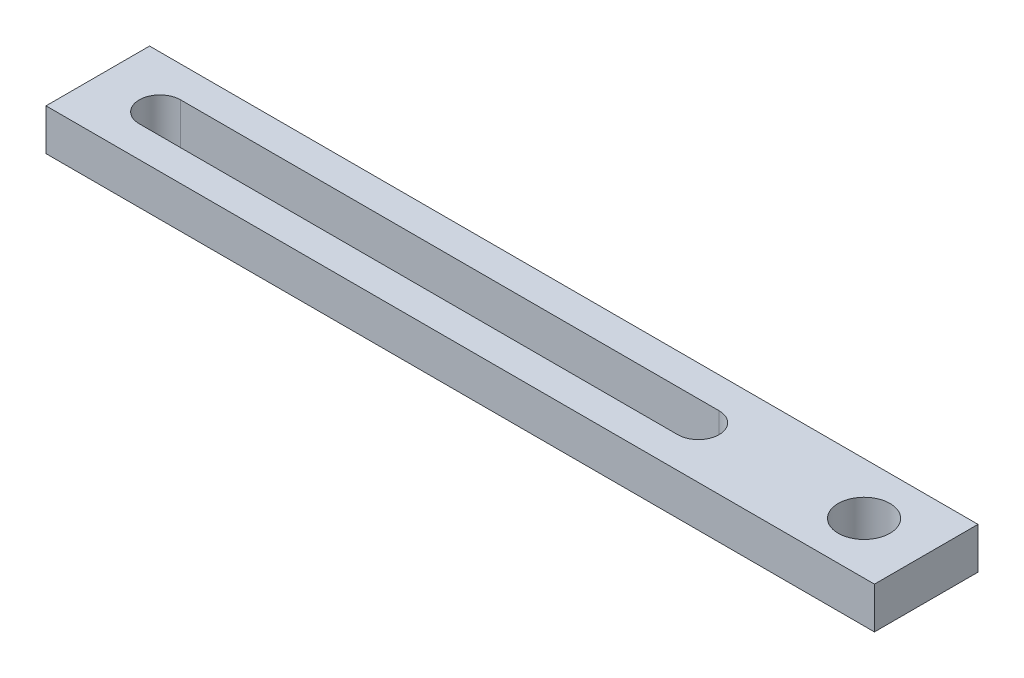
ISO-10303-21;
HEADER;
FILE_DESCRIPTION(('STEP AP214'),'2;1');
FILE_NAME('part.step','',(''),(''),'','','');
FILE_SCHEMA(('AUTOMOTIVE_DESIGN { 1 0 10303 214 1 1 1 1 }'));
ENDSEC;
DATA;
#1=APPLICATION_CONTEXT('core data for automotive mechanical design processes');
#2=APPLICATION_PROTOCOL_DEFINITION('international standard','automotive_design',2000,#1);
#3=PRODUCT_CONTEXT('',#1,'mechanical');
#4=PRODUCT('Part','Part','',(#3));
#5=PRODUCT_RELATED_PRODUCT_CATEGORY('part','',(#4));
#6=PRODUCT_DEFINITION_FORMATION('','',#4);
#7=PRODUCT_DEFINITION_CONTEXT('part definition',#1,'design');
#8=PRODUCT_DEFINITION('design','',#6,#7);
#9=PRODUCT_DEFINITION_SHAPE('','',#8);
#10=(LENGTH_UNIT() NAMED_UNIT(*) SI_UNIT(.MILLI.,.METRE.));
#11=(NAMED_UNIT(*) PLANE_ANGLE_UNIT() SI_UNIT($,.RADIAN.));
#12=(NAMED_UNIT(*) SI_UNIT($,.STERADIAN.) SOLID_ANGLE_UNIT());
#13=UNCERTAINTY_MEASURE_WITH_UNIT(LENGTH_MEASURE(1.E-05),#10,'distance_accuracy_value','');
#14=(GEOMETRIC_REPRESENTATION_CONTEXT(3) GLOBAL_UNCERTAINTY_ASSIGNED_CONTEXT((#13)) GLOBAL_UNIT_ASSIGNED_CONTEXT((#10,
#11,#12)) REPRESENTATION_CONTEXT('',''));
#15=CARTESIAN_POINT('',(0.,0.,0.));
#16=DIRECTION('',(0.,0.,1.));
#17=DIRECTION('',(1.,0.,0.));
#18=AXIS2_PLACEMENT_3D('',#15,#16,#17);
#19=CARTESIAN_POINT('',(0.,12.7,0.));
#20=DIRECTION('',(0.,-1.,0.));
#21=DIRECTION('',(0.,0.,-1.));
#22=AXIS2_PLACEMENT_3D('',#19,#20,#21);
#23=PLANE('',#22);
#24=DIRECTION('',(0.,0.,-1.));
#25=VECTOR('',#24,1.);
#26=CARTESIAN_POINT('',(0.,12.7,0.));
#27=LINE('',#26,#25);
#28=CARTESIAN_POINT('',(0.,12.7,31.75));
#29=VERTEX_POINT('',#28);
#30=CARTESIAN_POINT('',(0.,12.7,0.));
#31=VERTEX_POINT('',#30);
#32=EDGE_CURVE('E136',#29,#31,#27,.T.);
#33=ORIENTED_EDGE('',*,*,#32,.T.);
#34=DIRECTION('',(-1.,0.,0.));
#35=VECTOR('',#34,1.);
#36=CARTESIAN_POINT('',(0.,12.7,0.));
#37=LINE('',#36,#35);
#38=CARTESIAN_POINT('',(-254.,12.7,0.));
#39=VERTEX_POINT('',#38);
#40=EDGE_CURVE('E139',#31,#39,#37,.T.);
#41=ORIENTED_EDGE('',*,*,#40,.T.);
#42=DIRECTION('',(0.,0.,1.));
#43=VECTOR('',#42,1.);
#44=CARTESIAN_POINT('',(-254.,12.7,0.));
#45=LINE('',#44,#43);
#46=CARTESIAN_POINT('',(-254.,12.7,31.75));
#47=VERTEX_POINT('',#46);
#48=EDGE_CURVE('E142',#39,#47,#45,.T.);
#49=ORIENTED_EDGE('',*,*,#48,.T.);
#50=DIRECTION('',(1.,0.,0.));
#51=VECTOR('',#50,1.);
#52=CARTESIAN_POINT('',(0.,12.7,31.75));
#53=LINE('',#52,#51);
#54=EDGE_CURVE('E144',#47,#29,#53,.T.);
#55=ORIENTED_EDGE('',*,*,#54,.T.);
#56=EDGE_LOOP('',(#33,#41,#49,#55));
#57=FACE_BOUND('',#56,.T.);
#58=CARTESIAN_POINT('',(-234.95,12.7,15.875));
#59=DIRECTION('',(0.,1.,0.));
#60=DIRECTION('',(0.,0.,1.));
#61=AXIS2_PLACEMENT_3D('',#58,#59,#60);
#62=CIRCLE('',#61,6.35);
#63=CARTESIAN_POINT('',(-234.95,12.7,9.525));
#64=VERTEX_POINT('',#63);
#65=CARTESIAN_POINT('',(-234.95,12.7,22.225));
#66=VERTEX_POINT('',#65);
#67=EDGE_CURVE('E97',#64,#66,#62,.T.);
#68=ORIENTED_EDGE('',*,*,#67,.F.);
#69=DIRECTION('',(-1.,0.,0.));
#70=VECTOR('',#69,1.);
#71=CARTESIAN_POINT('',(-234.95,12.7,9.525));
#72=LINE('',#71,#70);
#73=CARTESIAN_POINT('',(-69.85,12.7,9.525));
#74=VERTEX_POINT('',#73);
#75=EDGE_CURVE('E120',#74,#64,#72,.T.);
#76=ORIENTED_EDGE('',*,*,#75,.F.);
#77=CARTESIAN_POINT('',(-69.85,12.7,15.875));
#78=DIRECTION('',(0.,1.,0.));
#79=DIRECTION('',(0.,0.,1.));
#80=AXIS2_PLACEMENT_3D('',#77,#78,#79);
#81=CIRCLE('',#80,6.35);
#82=CARTESIAN_POINT('',(-69.85,12.7,22.225));
#83=VERTEX_POINT('',#82);
#84=EDGE_CURVE('E118',#83,#74,#81,.T.);
#85=ORIENTED_EDGE('',*,*,#84,.F.);
#86=DIRECTION('',(1.,0.,0.));
#87=VECTOR('',#86,1.);
#88=CARTESIAN_POINT('',(-234.95,12.7,22.225));
#89=LINE('',#88,#87);
#90=EDGE_CURVE('E105',#66,#83,#89,.T.);
#91=ORIENTED_EDGE('',*,*,#90,.F.);
#92=EDGE_LOOP('',(#68,#76,#85,#91));
#93=FACE_BOUND('',#92,.T.);
#94=CARTESIAN_POINT('',(-19.05,12.7,15.875));
#95=DIRECTION('',(0.,1.,0.));
#96=DIRECTION('',(0.,0.,1.));
#97=AXIS2_PLACEMENT_3D('',#94,#95,#96);
#98=CIRCLE('',#97,7.9375);
#99=CARTESIAN_POINT('',(-19.05,12.7,23.8125));
#100=VERTEX_POINT('',#99);
#101=EDGE_CURVE('E126',#100,#100,#98,.T.);
#102=ORIENTED_EDGE('',*,*,#101,.F.);
#103=EDGE_LOOP('',(#102));
#104=FACE_BOUND('',#103,.T.);
#105=ADVANCED_FACE('F32',(#57,#93,#104),#23,.F.);
#106=CARTESIAN_POINT('',(0.,0.,0.));
#107=DIRECTION('',(0.,-1.,0.));
#108=DIRECTION('',(0.,0.,-1.));
#109=AXIS2_PLACEMENT_3D('',#106,#107,#108);
#110=PLANE('',#109);
#111=DIRECTION('',(-1.,0.,0.));
#112=VECTOR('',#111,1.);
#113=CARTESIAN_POINT('',(-234.95,0.,9.525));
#114=LINE('',#113,#112);
#115=CARTESIAN_POINT('',(-69.85,0.,9.525));
#116=VERTEX_POINT('',#115);
#117=CARTESIAN_POINT('',(-234.95,0.,9.525));
#118=VERTEX_POINT('',#117);
#119=EDGE_CURVE('E106',#116,#118,#114,.T.);
#120=ORIENTED_EDGE('',*,*,#119,.T.);
#121=CARTESIAN_POINT('',(-234.95,0.,15.875));
#122=DIRECTION('',(0.,1.,0.));
#123=DIRECTION('',(0.,0.,1.));
#124=AXIS2_PLACEMENT_3D('',#121,#122,#123);
#125=CIRCLE('',#124,6.35);
#126=CARTESIAN_POINT('',(-234.95,0.,22.225));
#127=VERTEX_POINT('',#126);
#128=EDGE_CURVE('E55',#118,#127,#125,.T.);
#129=ORIENTED_EDGE('',*,*,#128,.T.);
#130=DIRECTION('',(1.,0.,0.));
#131=VECTOR('',#130,1.);
#132=CARTESIAN_POINT('',(-234.95,0.,22.225));
#133=LINE('',#132,#131);
#134=CARTESIAN_POINT('',(-69.85,0.,22.225));
#135=VERTEX_POINT('',#134);
#136=EDGE_CURVE('E112',#127,#135,#133,.T.);
#137=ORIENTED_EDGE('',*,*,#136,.T.);
#138=CARTESIAN_POINT('',(-69.85,0.,15.875));
#139=DIRECTION('',(0.,1.,0.));
#140=DIRECTION('',(0.,0.,1.));
#141=AXIS2_PLACEMENT_3D('',#138,#139,#140);
#142=CIRCLE('',#141,6.35);
#143=EDGE_CURVE('E128',#135,#116,#142,.T.);
#144=ORIENTED_EDGE('',*,*,#143,.T.);
#145=EDGE_LOOP('',(#120,#129,#137,#144));
#146=FACE_BOUND('',#145,.T.);
#147=DIRECTION('',(0.,0.,-1.));
#148=VECTOR('',#147,1.);
#149=CARTESIAN_POINT('',(0.,0.,0.));
#150=LINE('',#149,#148);
#151=CARTESIAN_POINT('',(0.,0.,31.75));
#152=VERTEX_POINT('',#151);
#153=CARTESIAN_POINT('',(0.,0.,0.));
#154=VERTEX_POINT('',#153);
#155=EDGE_CURVE('E113',#152,#154,#150,.T.);
#156=ORIENTED_EDGE('',*,*,#155,.F.);
#157=DIRECTION('',(1.,0.,0.));
#158=VECTOR('',#157,1.);
#159=CARTESIAN_POINT('',(0.,0.,31.75));
#160=LINE('',#159,#158);
#161=CARTESIAN_POINT('',(-254.,0.,31.75));
#162=VERTEX_POINT('',#161);
#163=EDGE_CURVE('E140',#162,#152,#160,.T.);
#164=ORIENTED_EDGE('',*,*,#163,.F.);
#165=DIRECTION('',(0.,0.,1.));
#166=VECTOR('',#165,1.);
#167=CARTESIAN_POINT('',(-254.,0.,0.));
#168=LINE('',#167,#166);
#169=CARTESIAN_POINT('',(-254.,0.,0.));
#170=VERTEX_POINT('',#169);
#171=EDGE_CURVE('E151',#170,#162,#168,.T.);
#172=ORIENTED_EDGE('',*,*,#171,.F.);
#173=DIRECTION('',(-1.,0.,0.));
#174=VECTOR('',#173,1.);
#175=CARTESIAN_POINT('',(0.,0.,0.));
#176=LINE('',#175,#174);
#177=EDGE_CURVE('E149',#154,#170,#176,.T.);
#178=ORIENTED_EDGE('',*,*,#177,.F.);
#179=EDGE_LOOP('',(#156,#164,#172,#178));
#180=FACE_BOUND('',#179,.T.);
#181=CARTESIAN_POINT('',(-19.05,0.,15.875));
#182=DIRECTION('',(0.,1.,0.));
#183=DIRECTION('',(0.,0.,1.));
#184=AXIS2_PLACEMENT_3D('',#181,#182,#183);
#185=CIRCLE('',#184,7.9375);
#186=CARTESIAN_POINT('',(-19.05,0.,23.8125));
#187=VERTEX_POINT('',#186);
#188=EDGE_CURVE('E223',#187,#187,#185,.T.);
#189=ORIENTED_EDGE('',*,*,#188,.T.);
#190=EDGE_LOOP('',(#189));
#191=FACE_BOUND('',#190,.T.);
#192=ADVANCED_FACE('F169',(#146,#180,#191),#110,.T.);
#193=CARTESIAN_POINT('',(0.,12.7,0.));
#194=DIRECTION('',(-1.,0.,0.));
#195=DIRECTION('',(0.,0.,1.));
#196=AXIS2_PLACEMENT_3D('',#193,#194,#195);
#197=PLANE('',#196);
#198=ORIENTED_EDGE('',*,*,#155,.T.);
#199=DIRECTION('',(0.,-1.,0.));
#200=VECTOR('',#199,1.);
#201=CARTESIAN_POINT('',(0.,12.7,0.));
#202=LINE('',#201,#200);
#203=EDGE_CURVE('E11',#31,#154,#202,.T.);
#204=ORIENTED_EDGE('',*,*,#203,.F.);
#205=ORIENTED_EDGE('',*,*,#32,.F.);
#206=DIRECTION('',(0.,-1.,0.));
#207=VECTOR('',#206,1.);
#208=CARTESIAN_POINT('',(0.,12.7,31.75));
#209=LINE('',#208,#207);
#210=EDGE_CURVE('E146',#29,#152,#209,.T.);
#211=ORIENTED_EDGE('',*,*,#210,.T.);
#212=EDGE_LOOP('',(#198,#204,#205,#211));
#213=FACE_BOUND('',#212,.T.);
#214=ADVANCED_FACE('F34',(#213),#197,.F.);
#215=CARTESIAN_POINT('',(0.,12.7,0.));
#216=DIRECTION('',(0.,0.,1.));
#217=DIRECTION('',(1.,0.,0.));
#218=AXIS2_PLACEMENT_3D('',#215,#216,#217);
#219=PLANE('',#218);
#220=ORIENTED_EDGE('',*,*,#177,.T.);
#221=DIRECTION('',(0.,-1.,0.));
#222=VECTOR('',#221,1.);
#223=CARTESIAN_POINT('',(-254.,12.7,0.));
#224=LINE('',#223,#222);
#225=EDGE_CURVE('E40',#39,#170,#224,.T.);
#226=ORIENTED_EDGE('',*,*,#225,.F.);
#227=ORIENTED_EDGE('',*,*,#40,.F.);
#228=ORIENTED_EDGE('',*,*,#203,.T.);
#229=EDGE_LOOP('',(#220,#226,#227,#228));
#230=FACE_BOUND('',#229,.T.);
#231=ADVANCED_FACE('F179',(#230),#219,.F.);
#232=CARTESIAN_POINT('',(-254.,12.7,0.));
#233=DIRECTION('',(1.,0.,0.));
#234=DIRECTION('',(0.,0.,-1.));
#235=AXIS2_PLACEMENT_3D('',#232,#233,#234);
#236=PLANE('',#235);
#237=ORIENTED_EDGE('',*,*,#171,.T.);
#238=DIRECTION('',(0.,-1.,0.));
#239=VECTOR('',#238,1.);
#240=CARTESIAN_POINT('',(-254.,12.7,31.75));
#241=LINE('',#240,#239);
#242=EDGE_CURVE('E156',#47,#162,#241,.T.);
#243=ORIENTED_EDGE('',*,*,#242,.F.);
#244=ORIENTED_EDGE('',*,*,#48,.F.);
#245=ORIENTED_EDGE('',*,*,#225,.T.);
#246=EDGE_LOOP('',(#237,#243,#244,#245));
#247=FACE_BOUND('',#246,.T.);
#248=ADVANCED_FACE('F163',(#247),#236,.F.);
#249=CARTESIAN_POINT('',(0.,12.7,31.75));
#250=DIRECTION('',(0.,0.,-1.));
#251=DIRECTION('',(-1.,0.,0.));
#252=AXIS2_PLACEMENT_3D('',#249,#250,#251);
#253=PLANE('',#252);
#254=ORIENTED_EDGE('',*,*,#163,.T.);
#255=ORIENTED_EDGE('',*,*,#210,.F.);
#256=ORIENTED_EDGE('',*,*,#54,.F.);
#257=ORIENTED_EDGE('',*,*,#242,.T.);
#258=EDGE_LOOP('',(#254,#255,#256,#257));
#259=FACE_BOUND('',#258,.T.);
#260=ADVANCED_FACE('F173',(#259),#253,.F.);
#261=CARTESIAN_POINT('',(-234.95,12.7,15.875));
#262=DIRECTION('',(0.,-1.,0.));
#263=DIRECTION('',(0.,0.,-1.));
#264=AXIS2_PLACEMENT_3D('',#261,#262,#263);
#265=CYLINDRICAL_SURFACE('',#264,6.35);
#266=ORIENTED_EDGE('',*,*,#128,.F.);
#267=DIRECTION('',(0.,-1.,0.));
#268=VECTOR('',#267,1.);
#269=CARTESIAN_POINT('',(-234.95,12.7,9.525));
#270=LINE('',#269,#268);
#271=EDGE_CURVE('E101',#64,#118,#270,.T.);
#272=ORIENTED_EDGE('',*,*,#271,.F.);
#273=ORIENTED_EDGE('',*,*,#67,.T.);
#274=DIRECTION('',(0.,-1.,0.));
#275=VECTOR('',#274,1.);
#276=CARTESIAN_POINT('',(-234.95,12.7,22.225));
#277=LINE('',#276,#275);
#278=EDGE_CURVE('E100',#66,#127,#277,.T.);
#279=ORIENTED_EDGE('',*,*,#278,.T.);
#280=EDGE_LOOP('',(#266,#272,#273,#279));
#281=FACE_BOUND('',#280,.T.);
#282=ADVANCED_FACE('F99',(#281),#265,.F.);
#283=CARTESIAN_POINT('',(-234.95,12.7,22.225));
#284=DIRECTION('',(0.,0.,-1.));
#285=DIRECTION('',(-1.,0.,0.));
#286=AXIS2_PLACEMENT_3D('',#283,#284,#285);
#287=PLANE('',#286);
#288=ORIENTED_EDGE('',*,*,#136,.F.);
#289=ORIENTED_EDGE('',*,*,#278,.F.);
#290=ORIENTED_EDGE('',*,*,#90,.T.);
#291=DIRECTION('',(0.,-1.,0.));
#292=VECTOR('',#291,1.);
#293=CARTESIAN_POINT('',(-69.85,12.7,22.225));
#294=LINE('',#293,#292);
#295=EDGE_CURVE('E114',#83,#135,#294,.T.);
#296=ORIENTED_EDGE('',*,*,#295,.T.);
#297=EDGE_LOOP('',(#288,#289,#290,#296));
#298=FACE_BOUND('',#297,.T.);
#299=ADVANCED_FACE('F109',(#298),#287,.T.);
#300=CARTESIAN_POINT('',(-69.85,12.7,15.875));
#301=DIRECTION('',(0.,-1.,0.));
#302=DIRECTION('',(0.,0.,-1.));
#303=AXIS2_PLACEMENT_3D('',#300,#301,#302);
#304=CYLINDRICAL_SURFACE('',#303,6.35);
#305=ORIENTED_EDGE('',*,*,#143,.F.);
#306=ORIENTED_EDGE('',*,*,#295,.F.);
#307=ORIENTED_EDGE('',*,*,#84,.T.);
#308=DIRECTION('',(0.,-1.,0.));
#309=VECTOR('',#308,1.);
#310=CARTESIAN_POINT('',(-69.85,12.7,9.525));
#311=LINE('',#310,#309);
#312=EDGE_CURVE('E47',#74,#116,#311,.T.);
#313=ORIENTED_EDGE('',*,*,#312,.T.);
#314=EDGE_LOOP('',(#305,#306,#307,#313));
#315=FACE_BOUND('',#314,.T.);
#316=ADVANCED_FACE('F203',(#315),#304,.F.);
#317=CARTESIAN_POINT('',(-234.95,12.7,9.525));
#318=DIRECTION('',(0.,0.,1.));
#319=DIRECTION('',(1.,0.,0.));
#320=AXIS2_PLACEMENT_3D('',#317,#318,#319);
#321=PLANE('',#320);
#322=ORIENTED_EDGE('',*,*,#119,.F.);
#323=ORIENTED_EDGE('',*,*,#312,.F.);
#324=ORIENTED_EDGE('',*,*,#75,.T.);
#325=ORIENTED_EDGE('',*,*,#271,.T.);
#326=EDGE_LOOP('',(#322,#323,#324,#325));
#327=FACE_BOUND('',#326,.T.);
#328=ADVANCED_FACE('F207',(#327),#321,.T.);
#329=CARTESIAN_POINT('',(-19.05,12.7,15.875));
#330=DIRECTION('',(0.,-1.,0.));
#331=DIRECTION('',(0.,0.,-1.));
#332=AXIS2_PLACEMENT_3D('',#329,#330,#331);
#333=CYLINDRICAL_SURFACE('',#332,7.9375);
#334=ORIENTED_EDGE('',*,*,#101,.T.);
#335=EDGE_LOOP('',(#334));
#336=FACE_BOUND('',#335,.T.);
#337=ORIENTED_EDGE('',*,*,#188,.F.);
#338=EDGE_LOOP('',(#337));
#339=FACE_BOUND('',#338,.T.);
#340=ADVANCED_FACE('F213',(#336,#339),#333,.F.);
#341=CLOSED_SHELL('',(#105,#192,#214,#231,#248,#260,#282,#299,#316,#328,#340));
#342=MANIFOLD_SOLID_BREP('B2',#341);
#343=ADVANCED_BREP_SHAPE_REPRESENTATION('',(#18,#342),#14);
#344=SHAPE_DEFINITION_REPRESENTATION(#9,#343);
ENDSEC;
END-ISO-10303-21;
